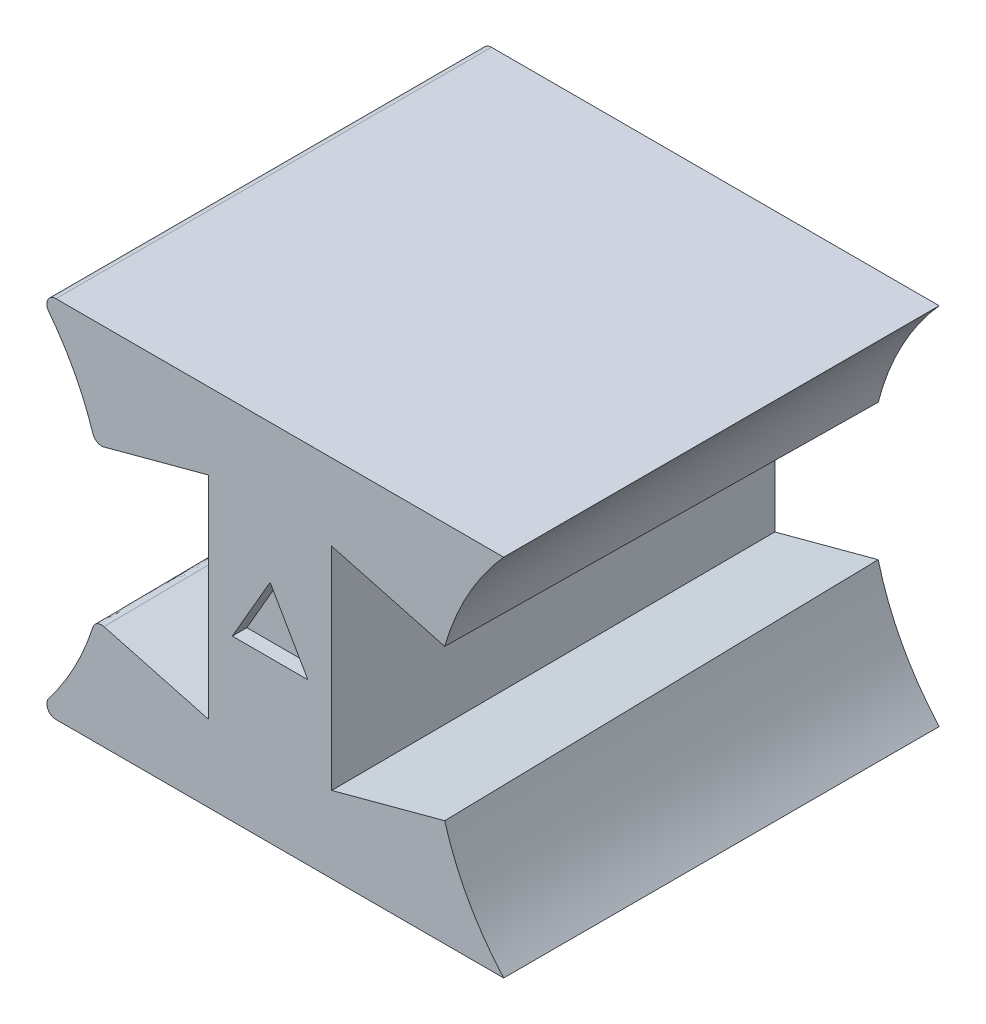
ISO-10303-21;
HEADER;
FILE_DESCRIPTION(('STEP AP214'),'2;1');
FILE_NAME('part.step','',(''),(''),'','','');
FILE_SCHEMA(('AUTOMOTIVE_DESIGN { 1 0 10303 214 1 1 1 1 }'));
ENDSEC;
DATA;
#1=APPLICATION_CONTEXT('core data for automotive mechanical design processes');
#2=APPLICATION_PROTOCOL_DEFINITION('international standard','automotive_design',2000,#1);
#3=PRODUCT_CONTEXT('',#1,'mechanical');
#4=PRODUCT('Part','Part','',(#3));
#5=PRODUCT_RELATED_PRODUCT_CATEGORY('part','',(#4));
#6=PRODUCT_DEFINITION_FORMATION('','',#4);
#7=PRODUCT_DEFINITION_CONTEXT('part definition',#1,'design');
#8=PRODUCT_DEFINITION('design','',#6,#7);
#9=PRODUCT_DEFINITION_SHAPE('','',#8);
#10=(LENGTH_UNIT() NAMED_UNIT(*) SI_UNIT(.MILLI.,.METRE.));
#11=(NAMED_UNIT(*) PLANE_ANGLE_UNIT() SI_UNIT($,.RADIAN.));
#12=(NAMED_UNIT(*) SI_UNIT($,.STERADIAN.) SOLID_ANGLE_UNIT());
#13=UNCERTAINTY_MEASURE_WITH_UNIT(LENGTH_MEASURE(1.E-05),#10,'distance_accuracy_value','');
#14=(GEOMETRIC_REPRESENTATION_CONTEXT(3) GLOBAL_UNCERTAINTY_ASSIGNED_CONTEXT((#13)) GLOBAL_UNIT_ASSIGNED_CONTEXT((#10,
#11,#12)) REPRESENTATION_CONTEXT('',''));
#15=CARTESIAN_POINT('',(0.,0.,0.));
#16=DIRECTION('',(0.,0.,1.));
#17=DIRECTION('',(1.,0.,0.));
#18=AXIS2_PLACEMENT_3D('',#15,#16,#17);
#19=CARTESIAN_POINT('',(0.,0.,-14.));
#20=DIRECTION('',(0.,0.,1.));
#21=DIRECTION('',(0.236420781889134,0.971650767452448,0.));
#22=AXIS2_PLACEMENT_3D('',#19,#20,#21);
#23=CYLINDRICAL_SURFACE('',#22,15.);
#24=CARTESIAN_POINT('',(0.,0.,-34.2436863156225));
#25=DIRECTION('',(-0.25878212734058,0.965788047325803,-0.0168895888551719));
#26=DIRECTION('',(-0.00437134725966975,0.0163140900706145,0.99985736072117));
#27=AXIS2_PLACEMENT_3D('',#24,#25,#26);
#28=ELLIPSE('',#27,888.121086228027,15.);
#29=CARTESIAN_POINT('',(14.2779785755318,4.59775247231231,9.9));
#30=VERTEX_POINT('',#29);
#31=CARTESIAN_POINT('',(14.396617108475,4.21158115580895,-14.));
#32=VERTEX_POINT('',#31);
#33=EDGE_CURVE('E209',#30,#32,#28,.T.);
#34=ORIENTED_EDGE('',*,*,#33,.F.);
#35=CARTESIAN_POINT('',(0.,0.,9.9));
#36=DIRECTION('',(0.,0.,-1.));
#37=DIRECTION('',(0.236420781889134,0.971650767452448,0.));
#38=AXIS2_PLACEMENT_3D('',#35,#36,#37);
#39=CIRCLE('',#38,15.);
#40=CARTESIAN_POINT('',(11.8523697231444,9.19354838709677,9.9));
#41=VERTEX_POINT('',#40);
#42=EDGE_CURVE('E341',#41,#30,#39,.T.);
#43=ORIENTED_EDGE('',*,*,#42,.F.);
#44=DIRECTION('',(0.,0.,1.));
#45=VECTOR('',#44,1.);
#46=CARTESIAN_POINT('',(11.8523697231444,9.19354838709677,-14.));
#47=LINE('',#46,#45);
#48=CARTESIAN_POINT('',(11.8523697231444,9.19354838709677,-14.));
#49=VERTEX_POINT('',#48);
#50=EDGE_CURVE('E343',#49,#41,#47,.T.);
#51=ORIENTED_EDGE('',*,*,#50,.F.);
#52=CARTESIAN_POINT('',(0.,0.,-14.));
#53=DIRECTION('',(0.,0.,-1.));
#54=DIRECTION('',(0.236420781889134,0.971650767452448,0.));
#55=AXIS2_PLACEMENT_3D('',#52,#53,#54);
#56=CIRCLE('',#55,15.);
#57=EDGE_CURVE('E236',#49,#32,#56,.T.);
#58=ORIENTED_EDGE('',*,*,#57,.T.);
#59=EDGE_LOOP('',(#34,#43,#51,#58));
#60=FACE_BOUND('',#59,.T.);
#61=ADVANCED_FACE('F16',(#60),#23,.F.);
#62=CARTESIAN_POINT('',(11.1803398874989,-10.,-14.));
#63=DIRECTION('',(0.,-1.,0.));
#64=DIRECTION('',(0.,0.,-1.));
#65=AXIS2_PLACEMENT_3D('',#62,#63,#64);
#66=PLANE('',#65);
#67=DIRECTION('',(0.,0.,1.));
#68=VECTOR('',#67,1.);
#69=CARTESIAN_POINT('',(12.2474487139159,-10.,-14.));
#70=LINE('',#69,#68);
#71=CARTESIAN_POINT('',(12.2474487139159,-10.,-14.));
#72=VERTEX_POINT('',#71);
#73=CARTESIAN_POINT('',(12.2474487139159,-10.,9.9));
#74=VERTEX_POINT('',#73);
#75=EDGE_CURVE('E244',#72,#74,#70,.T.);
#76=ORIENTED_EDGE('',*,*,#75,.F.);
#77=DIRECTION('',(-1.,0.,0.));
#78=VECTOR('',#77,1.);
#79=CARTESIAN_POINT('',(30.,-10.,-14.));
#80=LINE('',#79,#78);
#81=CARTESIAN_POINT('',(36.819660112501,-10.,-14.));
#82=VERTEX_POINT('',#81);
#83=EDGE_CURVE('E255',#82,#72,#80,.T.);
#84=ORIENTED_EDGE('',*,*,#83,.F.);
#85=DIRECTION('',(0.,0.,1.));
#86=VECTOR('',#85,1.);
#87=CARTESIAN_POINT('',(36.819660112501,-10.,0.));
#88=LINE('',#87,#86);
#89=CARTESIAN_POINT('',(36.819660112501,-10.,9.9));
#90=VERTEX_POINT('',#89);
#91=EDGE_CURVE('E228',#82,#90,#88,.T.);
#92=ORIENTED_EDGE('',*,*,#91,.T.);
#93=DIRECTION('',(1.,0.,0.));
#94=VECTOR('',#93,1.);
#95=CARTESIAN_POINT('',(30.,-10.,9.9));
#96=LINE('',#95,#94);
#97=EDGE_CURVE('E260',#74,#90,#96,.T.);
#98=ORIENTED_EDGE('',*,*,#97,.F.);
#99=EDGE_LOOP('',(#76,#84,#92,#98));
#100=FACE_BOUND('',#99,.T.);
#101=ADVANCED_FACE('F467',(#100),#66,.T.);
#102=CARTESIAN_POINT('',(20.1999695390313,5.,-14.0034904812875));
#103=DIRECTION('',(0.999847695156391,0.,-0.0174524064372835));
#104=DIRECTION('',(0.,-1.,0.));
#105=AXIS2_PLACEMENT_3D('',#102,#103,#104);
#106=PLANE('',#105);
#107=DIRECTION('',(0.,-1.,0.));
#108=VECTOR('',#107,1.);
#109=CARTESIAN_POINT('',(20.6172065173932,2.5,9.9));
#110=LINE('',#109,#108);
#111=CARTESIAN_POINT('',(20.6172065173932,5.80435919374975,9.9));
#112=VERTEX_POINT('',#111);
#113=CARTESIAN_POINT('',(20.6172065173932,-5.80435919374975,9.9));
#114=VERTEX_POINT('',#113);
#115=EDGE_CURVE('E175',#112,#114,#110,.T.);
#116=ORIENTED_EDGE('',*,*,#115,.F.);
#117=DIRECTION('',(0.0174478940480441,0.0227385382260561,0.999589180550005));
#118=VECTOR('',#117,1.);
#119=CARTESIAN_POINT('',(20.1987519787187,5.25901862156866,-14.0732444648759));
#120=LINE('',#119,#118);
#121=CARTESIAN_POINT('',(20.2000304656088,5.2606847781226,-14.));
#122=VERTEX_POINT('',#121);
#123=EDGE_CURVE('E297',#122,#112,#120,.T.);
#124=ORIENTED_EDGE('',*,*,#123,.F.);
#125=DIRECTION('',(0.,-1.,0.));
#126=VECTOR('',#125,1.);
#127=CARTESIAN_POINT('',(20.2000304656088,2.5,-14.));
#128=LINE('',#127,#126);
#129=CARTESIAN_POINT('',(20.2000304656088,-5.26068477812261,-14.));
#130=VERTEX_POINT('',#129);
#131=EDGE_CURVE('E240',#122,#130,#128,.T.);
#132=ORIENTED_EDGE('',*,*,#131,.T.);
#133=DIRECTION('',(0.0174478940480441,-0.0227385382260562,0.999589180550005));
#134=VECTOR('',#133,1.);
#135=CARTESIAN_POINT('',(20.1978824485278,-5.25788542776143,-14.1230598161492));
#136=LINE('',#135,#134);
#137=EDGE_CURVE('E180',#130,#114,#136,.T.);
#138=ORIENTED_EDGE('',*,*,#137,.T.);
#139=EDGE_LOOP('',(#116,#124,#132,#138));
#140=FACE_BOUND('',#139,.T.);
#141=ADVANCED_FACE('F472',(#140),#106,.F.);
#142=CARTESIAN_POINT('',(27.8000304609687,-5.,-14.0034904812875));
#143=DIRECTION('',(-0.999847695156391,0.,-0.0174524064372835));
#144=DIRECTION('',(-0.0174524064372835,0.,0.999847695156391));
#145=AXIS2_PLACEMENT_3D('',#142,#143,#144);
#146=PLANE('',#145);
#147=DIRECTION('',(0.,1.,0.));
#148=VECTOR('',#147,1.);
#149=CARTESIAN_POINT('',(27.3827934826068,-2.5,9.9));
#150=LINE('',#149,#148);
#151=CARTESIAN_POINT('',(27.3827934826068,-5.80435919374975,9.9));
#152=VERTEX_POINT('',#151);
#153=CARTESIAN_POINT('',(27.3827934826068,5.80435919374975,9.9));
#154=VERTEX_POINT('',#153);
#155=EDGE_CURVE('E207',#152,#154,#150,.T.);
#156=ORIENTED_EDGE('',*,*,#155,.F.);
#157=DIRECTION('',(-0.0174478940480441,-0.0227385382260561,0.999589180550005));
#158=VECTOR('',#157,1.);
#159=CARTESIAN_POINT('',(27.8012480212812,-5.25901862156866,-14.0732444648759));
#160=LINE('',#159,#158);
#161=CARTESIAN_POINT('',(27.7999695343912,-5.2606847781226,-14.));
#162=VERTEX_POINT('',#161);
#163=EDGE_CURVE('E11',#162,#152,#160,.T.);
#164=ORIENTED_EDGE('',*,*,#163,.F.);
#165=DIRECTION('',(0.,-1.,0.));
#166=VECTOR('',#165,1.);
#167=CARTESIAN_POINT('',(27.7999695343912,-2.5,-14.));
#168=LINE('',#167,#166);
#169=CARTESIAN_POINT('',(27.7999695343912,5.2606847781226,-14.));
#170=VERTEX_POINT('',#169);
#171=EDGE_CURVE('E222',#170,#162,#168,.T.);
#172=ORIENTED_EDGE('',*,*,#171,.F.);
#173=DIRECTION('',(-0.0174478940480441,0.0227385382260562,0.999589180550005));
#174=VECTOR('',#173,1.);
#175=CARTESIAN_POINT('',(27.8021175514722,5.25788542776143,-14.1230598161492));
#176=LINE('',#175,#174);
#177=EDGE_CURVE('E241',#170,#154,#176,.T.);
#178=ORIENTED_EDGE('',*,*,#177,.T.);
#179=EDGE_LOOP('',(#156,#164,#172,#178));
#180=FACE_BOUND('',#179,.T.);
#181=ADVANCED_FACE('F565',(#180),#146,.F.);
#182=CARTESIAN_POINT('',(33.4769944133549,-3.73946747055844,-14.0034904812875));
#183=DIRECTION('',(0.258779625708333,-0.965778711107158,-0.0174524064372835));
#184=DIRECTION('',(0.,0.0180678631194738,-0.999836762837963));
#185=AXIS2_PLACEMENT_3D('',#182,#183,#184);
#186=PLANE('',#185);
#187=DIRECTION('',(-0.965925826289068,-0.258819045102521,0.));
#188=VECTOR('',#187,1.);
#189=CARTESIAN_POINT('',(28.0406312648972,-5.62809209123437,9.9));
#190=LINE('',#189,#188);
#191=CARTESIAN_POINT('',(33.5834667493533,-4.14289379939574,9.9));
#192=VERTEX_POINT('',#191);
#193=EDGE_CURVE('E289',#192,#152,#190,.T.);
#194=ORIENTED_EDGE('',*,*,#193,.F.);
#195=CARTESIAN_POINT('',(48.,0.,-5.59434206634731));
#196=DIRECTION('',(0.258779625708333,-0.965778711107158,-0.0174524064372835));
#197=DIRECTION('',(-0.00451701516883879,0.0168577301086657,-0.999847695156391));
#198=AXIS2_PLACEMENT_3D('',#195,#196,#197);
#199=ELLIPSE('',#198,859.480327478255,15.);
#200=CARTESIAN_POINT('',(33.4738314749044,-3.7403780531965,-14.));
#201=VERTEX_POINT('',#200);
#202=EDGE_CURVE('E27',#192,#201,#199,.T.);
#203=ORIENTED_EDGE('',*,*,#202,.T.);
#204=DIRECTION('',(0.965925826289068,0.258819045102521,0.));
#205=VECTOR('',#204,1.);
#206=CARTESIAN_POINT('',(27.9326581575347,-5.22513096870651,-14.));
#207=LINE('',#206,#205);
#208=EDGE_CURVE('E217',#162,#201,#207,.T.);
#209=ORIENTED_EDGE('',*,*,#208,.F.);
#210=ORIENTED_EDGE('',*,*,#163,.T.);
#211=EDGE_LOOP('',(#194,#203,#209,#210));
#212=FACE_BOUND('',#211,.T.);
#213=ADVANCED_FACE('F498',(#212),#186,.F.);
#214=CARTESIAN_POINT('',(48.,0.,0.));
#215=DIRECTION('',(0.,0.,1.));
#216=DIRECTION('',(-1.,0.,0.));
#217=AXIS2_PLACEMENT_3D('',#214,#215,#216);
#218=CYLINDRICAL_SURFACE('',#217,15.);
#219=CARTESIAN_POINT('',(48.,0.,9.9));
#220=DIRECTION('',(0.,0.,-1.));
#221=DIRECTION('',(-1.,0.,0.));
#222=AXIS2_PLACEMENT_3D('',#219,#220,#221);
#223=CIRCLE('',#222,15.);
#224=EDGE_CURVE('E293',#90,#192,#223,.T.);
#225=ORIENTED_EDGE('',*,*,#224,.F.);
#226=ORIENTED_EDGE('',*,*,#91,.F.);
#227=CARTESIAN_POINT('',(48.,0.,-14.));
#228=DIRECTION('',(0.,0.,1.));
#229=DIRECTION('',(-1.,0.,0.));
#230=AXIS2_PLACEMENT_3D('',#227,#228,#229);
#231=CIRCLE('',#230,15.);
#232=EDGE_CURVE('E221',#201,#82,#231,.T.);
#233=ORIENTED_EDGE('',*,*,#232,.F.);
#234=ORIENTED_EDGE('',*,*,#202,.F.);
#235=EDGE_LOOP('',(#225,#226,#233,#234));
#236=FACE_BOUND('',#235,.T.);
#237=ADVANCED_FACE('F495',(#236),#218,.F.);
#238=CARTESIAN_POINT('',(48.,0.,0.));
#239=DIRECTION('',(0.,0.,1.));
#240=DIRECTION('',(-1.,0.,0.));
#241=AXIS2_PLACEMENT_3D('',#238,#239,#240);
#242=CYLINDRICAL_SURFACE('',#241,15.);
#243=CARTESIAN_POINT('',(48.,0.,9.9));
#244=DIRECTION('',(0.,0.,-1.));
#245=DIRECTION('',(-1.,0.,0.));
#246=AXIS2_PLACEMENT_3D('',#243,#244,#245);
#247=CIRCLE('',#246,15.);
#248=CARTESIAN_POINT('',(33.5834667493533,4.14289379939574,9.9));
#249=VERTEX_POINT('',#248);
#250=CARTESIAN_POINT('',(36.819660112501,10.,9.9));
#251=VERTEX_POINT('',#250);
#252=EDGE_CURVE('E227',#249,#251,#247,.T.);
#253=ORIENTED_EDGE('',*,*,#252,.F.);
#254=CARTESIAN_POINT('',(48.,0.,-5.59434206634742));
#255=DIRECTION('',(0.258779625708334,0.965778711107158,-0.0174524064372836));
#256=DIRECTION('',(-0.00451701516883882,-0.0168577301086658,-0.999847695156391));
#257=AXIS2_PLACEMENT_3D('',#254,#255,#256);
#258=ELLIPSE('',#257,859.480327478251,15.);
#259=CARTESIAN_POINT('',(33.4738314749044,3.7403780531965,-14.));
#260=VERTEX_POINT('',#259);
#261=EDGE_CURVE('E231',#260,#249,#258,.T.);
#262=ORIENTED_EDGE('',*,*,#261,.F.);
#263=CARTESIAN_POINT('',(48.,0.,-14.));
#264=DIRECTION('',(0.,0.,1.));
#265=DIRECTION('',(-1.,0.,0.));
#266=AXIS2_PLACEMENT_3D('',#263,#264,#265);
#267=CIRCLE('',#266,15.);
#268=CARTESIAN_POINT('',(36.819660112501,10.,-14.));
#269=VERTEX_POINT('',#268);
#270=EDGE_CURVE('E324',#269,#260,#267,.T.);
#271=ORIENTED_EDGE('',*,*,#270,.F.);
#272=DIRECTION('',(0.,0.,-1.));
#273=VECTOR('',#272,1.);
#274=CARTESIAN_POINT('',(36.819660112501,10.,0.));
#275=LINE('',#274,#273);
#276=EDGE_CURVE('E128',#251,#269,#275,.T.);
#277=ORIENTED_EDGE('',*,*,#276,.F.);
#278=EDGE_LOOP('',(#253,#262,#271,#277));
#279=FACE_BOUND('',#278,.T.);
#280=ADVANCED_FACE('F494',(#279),#242,.F.);
#281=CARTESIAN_POINT('',(28.0517559251417,5.19315574222143,-14.0034904812875));
#282=DIRECTION('',(0.258779625708334,0.965778711107158,-0.0174524064372835));
#283=DIRECTION('',(-0.0672883413953232,0.,-0.997733571206395));
#284=AXIS2_PLACEMENT_3D('',#281,#282,#283);
#285=PLANE('',#284);
#286=DIRECTION('',(0.965925826289068,-0.258819045102521,0.));
#287=VECTOR('',#286,1.);
#288=CARTESIAN_POINT('',(25.3280120207905,6.35493622706587,9.9));
#289=LINE('',#288,#287);
#290=EDGE_CURVE('E250',#154,#249,#289,.T.);
#291=ORIENTED_EDGE('',*,*,#290,.F.);
#292=ORIENTED_EDGE('',*,*,#177,.F.);
#293=DIRECTION('',(-0.965925826289068,0.258819045102521,0.));
#294=VECTOR('',#293,1.);
#295=CARTESIAN_POINT('',(25.220038913428,5.95197510453801,-14.));
#296=LINE('',#295,#294);
#297=EDGE_CURVE('E20',#260,#170,#296,.T.);
#298=ORIENTED_EDGE('',*,*,#297,.F.);
#299=ORIENTED_EDGE('',*,*,#261,.T.);
#300=EDGE_LOOP('',(#291,#292,#298,#299));
#301=FACE_BOUND('',#300,.T.);
#302=ADVANCED_FACE('F415',(#301),#285,.F.);
#303=CARTESIAN_POINT('',(0.,0.,-14.));
#304=DIRECTION('',(0.,0.,1.));
#305=DIRECTION('',(0.971650767452448,-0.236420781889134,0.));
#306=AXIS2_PLACEMENT_3D('',#303,#304,#305);
#307=CYLINDRICAL_SURFACE('',#306,15.);
#308=CARTESIAN_POINT('',(0.,0.,-34.2436863156225));
#309=DIRECTION('',(-0.25878212734058,-0.965788047325803,-0.016889588855172));
#310=DIRECTION('',(-0.00437134725966978,-0.0163140900706146,0.99985736072117));
#311=AXIS2_PLACEMENT_3D('',#308,#309,#310);
#312=ELLIPSE('',#311,888.121086228023,15.);
#313=CARTESIAN_POINT('',(14.396617108475,-4.21158115580895,-14.));
#314=VERTEX_POINT('',#313);
#315=CARTESIAN_POINT('',(14.2779785755318,-4.59775247231231,9.9));
#316=VERTEX_POINT('',#315);
#317=EDGE_CURVE('E194',#314,#316,#312,.T.);
#318=ORIENTED_EDGE('',*,*,#317,.F.);
#319=CARTESIAN_POINT('',(0.,0.,-14.));
#320=DIRECTION('',(0.,0.,-1.));
#321=DIRECTION('',(0.971650767452448,-0.236420781889134,0.));
#322=AXIS2_PLACEMENT_3D('',#319,#320,#321);
#323=CIRCLE('',#322,15.);
#324=CARTESIAN_POINT('',(11.8523697231444,-9.19354838709677,-14.));
#325=VERTEX_POINT('',#324);
#326=EDGE_CURVE('E254',#314,#325,#323,.T.);
#327=ORIENTED_EDGE('',*,*,#326,.T.);
#328=DIRECTION('',(0.,0.,-1.));
#329=VECTOR('',#328,1.);
#330=CARTESIAN_POINT('',(11.8523697231444,-9.19354838709677,-14.));
#331=LINE('',#330,#329);
#332=CARTESIAN_POINT('',(11.8523697231444,-9.19354838709677,9.9));
#333=VERTEX_POINT('',#332);
#334=EDGE_CURVE('E41',#333,#325,#331,.T.);
#335=ORIENTED_EDGE('',*,*,#334,.F.);
#336=CARTESIAN_POINT('',(0.,0.,9.9));
#337=DIRECTION('',(0.,0.,-1.));
#338=DIRECTION('',(0.971650767452448,-0.236420781889134,0.));
#339=AXIS2_PLACEMENT_3D('',#336,#337,#338);
#340=CIRCLE('',#339,15.);
#341=EDGE_CURVE('E232',#316,#333,#340,.T.);
#342=ORIENTED_EDGE('',*,*,#341,.F.);
#343=EDGE_LOOP('',(#318,#327,#335,#342));
#344=FACE_BOUND('',#343,.T.);
#345=ADVANCED_FACE('F489',(#344),#307,.F.);
#346=CARTESIAN_POINT('',(12.2474487139159,-9.5,-14.));
#347=DIRECTION('',(0.,0.,1.));
#348=DIRECTION('',(-0.898026510133878,-0.439941345064053,0.));
#349=AXIS2_PLACEMENT_3D('',#346,#347,#348);
#350=CYLINDRICAL_SURFACE('',#349,0.5);
#351=CARTESIAN_POINT('',(12.2474487139159,-9.5,9.9));
#352=DIRECTION('',(0.,0.,-1.));
#353=DIRECTION('',(-0.898026510133878,-0.439941345064053,0.));
#354=AXIS2_PLACEMENT_3D('',#351,#352,#353);
#355=CIRCLE('',#354,0.5);
#356=EDGE_CURVE('E235',#74,#333,#355,.T.);
#357=ORIENTED_EDGE('',*,*,#356,.T.);
#358=ORIENTED_EDGE('',*,*,#334,.T.);
#359=CARTESIAN_POINT('',(12.2474487139159,-9.5,-14.));
#360=DIRECTION('',(0.,0.,1.));
#361=DIRECTION('',(-0.898026510133878,-0.439941345064053,0.));
#362=AXIS2_PLACEMENT_3D('',#359,#360,#361);
#363=CIRCLE('',#362,0.5);
#364=EDGE_CURVE('E251',#325,#72,#363,.T.);
#365=ORIENTED_EDGE('',*,*,#364,.T.);
#366=ORIENTED_EDGE('',*,*,#75,.T.);
#367=EDGE_LOOP('',(#357,#358,#365,#366));
#368=FACE_BOUND('',#367,.T.);
#369=ADVANCED_FACE('F486',(#368),#350,.T.);
#370=CARTESIAN_POINT('',(30.,10.,-14.));
#371=DIRECTION('',(0.,1.,0.));
#372=DIRECTION('',(1.,0.,0.));
#373=AXIS2_PLACEMENT_3D('',#370,#371,#372);
#374=PLANE('',#373);
#375=DIRECTION('',(0.,0.,-1.));
#376=VECTOR('',#375,1.);
#377=CARTESIAN_POINT('',(12.2474487139159,10.,-14.));
#378=LINE('',#377,#376);
#379=CARTESIAN_POINT('',(12.2474487139159,10.,9.9));
#380=VERTEX_POINT('',#379);
#381=CARTESIAN_POINT('',(12.2474487139159,10.,-14.));
#382=VERTEX_POINT('',#381);
#383=EDGE_CURVE('E112',#380,#382,#378,.T.);
#384=ORIENTED_EDGE('',*,*,#383,.F.);
#385=DIRECTION('',(1.,0.,0.));
#386=VECTOR('',#385,1.);
#387=CARTESIAN_POINT('',(30.,10.,9.9));
#388=LINE('',#387,#386);
#389=EDGE_CURVE('E223',#380,#251,#388,.T.);
#390=ORIENTED_EDGE('',*,*,#389,.T.);
#391=ORIENTED_EDGE('',*,*,#276,.T.);
#392=DIRECTION('',(-1.,0.,0.));
#393=VECTOR('',#392,1.);
#394=CARTESIAN_POINT('',(30.,10.,-14.));
#395=LINE('',#394,#393);
#396=EDGE_CURVE('E321',#269,#382,#395,.T.);
#397=ORIENTED_EDGE('',*,*,#396,.T.);
#398=EDGE_LOOP('',(#384,#390,#391,#397));
#399=FACE_BOUND('',#398,.T.);
#400=ADVANCED_FACE('F476',(#399),#374,.T.);
#401=CARTESIAN_POINT('',(12.2474487139159,9.5,-14.));
#402=DIRECTION('',(0.,0.,1.));
#403=DIRECTION('',(-0.898026510133878,0.439941345064053,0.));
#404=AXIS2_PLACEMENT_3D('',#401,#402,#403);
#405=CYLINDRICAL_SURFACE('',#404,0.5);
#406=CARTESIAN_POINT('',(12.2474487139159,9.5,9.9));
#407=DIRECTION('',(0.,0.,-1.));
#408=DIRECTION('',(-0.898026510133878,0.439941345064053,0.));
#409=AXIS2_PLACEMENT_3D('',#406,#407,#408);
#410=CIRCLE('',#409,0.5);
#411=EDGE_CURVE('E226',#41,#380,#410,.T.);
#412=ORIENTED_EDGE('',*,*,#411,.T.);
#413=ORIENTED_EDGE('',*,*,#383,.T.);
#414=CARTESIAN_POINT('',(12.2474487139159,9.5,-14.));
#415=DIRECTION('',(0.,0.,1.));
#416=DIRECTION('',(-0.898026510133878,0.439941345064053,0.));
#417=AXIS2_PLACEMENT_3D('',#414,#415,#416);
#418=CIRCLE('',#417,0.5);
#419=EDGE_CURVE('E239',#382,#49,#418,.T.);
#420=ORIENTED_EDGE('',*,*,#419,.T.);
#421=ORIENTED_EDGE('',*,*,#50,.T.);
#422=EDGE_LOOP('',(#412,#413,#420,#421));
#423=FACE_BOUND('',#422,.T.);
#424=ADVANCED_FACE('F351',(#423),#405,.T.);
#425=CARTESIAN_POINT('',(20.5901699437495,0.,-14.));
#426=DIRECTION('',(0.,0.,-1.));
#427=DIRECTION('',(0.,-1.,0.));
#428=AXIS2_PLACEMENT_3D('',#425,#426,#427);
#429=PLANE('',#428);
#430=CARTESIAN_POINT('',(15.0059369348764,-3.86893161115116,-14.));
#431=CARTESIAN_POINT('',(14.9808296139587,-3.86220412478713,-14.));
#432=CARTESIAN_POINT('',(14.9552855212233,-3.85756376138786,-14.0000017699791));
#433=CARTESIAN_POINT('',(14.9295474830214,-3.85492551811501,-14.0000035830425));
#434=CARTESIAN_POINT('',(14.9031768291049,-3.85222242941219,-14.0000054406692));
#435=CARTESIAN_POINT('',(14.876601239717,-3.85162108010601,-14.0000073499109));
#436=CARTESIAN_POINT('',(14.850073255727,-3.85308314872191,-14.0000083855783));
#437=CARTESIAN_POINT('',(14.8376486477571,-3.8537679210508,-14.0000088706419));
#438=CARTESIAN_POINT('',(14.8252344876881,-3.85490607194999,-14.0000091765836));
#439=CARTESIAN_POINT('',(14.8128574041412,-3.85649754136232,-14.0000092699701));
#440=CARTESIAN_POINT('',(14.7864480360472,-3.85989330914244,-14.0000094692318));
#441=CARTESIAN_POINT('',(14.760411281655,-3.86532331956787,-14.000008661419));
#442=CARTESIAN_POINT('',(14.734996657679,-3.87273042326925,-14.0000071837427));
#443=CARTESIAN_POINT('',(14.7100241281233,-3.88000867835101,-14.000005731771));
#444=CARTESIAN_POINT('',(14.6856509771836,-3.88919617654534,-14.000003645017));
#445=CARTESIAN_POINT('',(14.6621254939157,-3.90028639255604,-14.0000019858542));
#446=CARTESIAN_POINT('',(14.6517365991257,-3.90518385145293,-14.000001253165));
#447=CARTESIAN_POINT('',(14.6415132778344,-3.9104529646475,-14.0000006126223));
#448=CARTESIAN_POINT('',(14.6314786397284,-3.91609597058369,-14.0000001941704));
#449=CARTESIAN_POINT('',(14.630793179429,-3.91648144104088,-14.0000001655862));
#450=CARTESIAN_POINT('',(14.6301086000948,-3.9168686567985,-14.0000001380467));
#451=CARTESIAN_POINT('',(14.6294249061219,-3.91725761314222,-14.0000001115167));
#452=CARTESIAN_POINT('',(14.6068527533807,-3.93009900468296,-13.999999235629));
#453=CARTESIAN_POINT('',(14.5854139236647,-3.94473672699098,-13.999999443561));
#454=CARTESIAN_POINT('',(14.565229626289,-3.96094378226358,-13.9999998087246));
#455=CARTESIAN_POINT('',(14.5445893210297,-3.97751699073126,-14.0000001821381));
#456=CARTESIAN_POINT('',(14.5252598923475,-3.99573216797561,-14.0000007402861));
#457=CARTESIAN_POINT('',(14.5074015823367,-4.01539050072652,-14.0000010781268));
#458=CARTESIAN_POINT('',(14.4990628735574,-4.02456970703423,-14.0000012358771));
#459=CARTESIAN_POINT('',(14.4910454351748,-4.03406409331954,-14.0000013518877));
#460=CARTESIAN_POINT('',(14.4833687453907,-4.04385570065226,-14.0000014076392));
#461=CARTESIAN_POINT('',(14.4669355461707,-4.06481622380848,-14.0000015269841));
#462=CARTESIAN_POINT('',(14.4521865395466,-4.08697670983229,-14.0000013834548));
#463=CARTESIAN_POINT('',(14.4392678222165,-4.11012748226572,-14.0000010839263));
#464=CARTESIAN_POINT('',(14.4266040298254,-4.13282142070403,-14.0000007903085));
#465=CARTESIAN_POINT('',(14.4156983098859,-4.15646807659685,-14.0000003690992));
#466=CARTESIAN_POINT('',(14.4067298757516,-4.18089565438254,-14.0000001478876));
#467=CARTESIAN_POINT('',(14.4030222185913,-4.19099430508695,-14.0000000564362));
#468=CARTESIAN_POINT('',(14.3996462183768,-4.20122663595498,-14.0000000000111));
#469=CARTESIAN_POINT('',(14.396617108475,-4.21158115580894,-14.0000000000002));
#470=(BOUNDED_CURVE() B_SPLINE_CURVE(3,(#430,#431,#432,#433,#434,#435,#436,#437,#438,#439,#440,
#441,#442,#443,#444,#445,#446,#447,#448,#449,#450,#451,#452,#453,#454,#455,#456,#457,#458,#459,
#460,#461,#462,#463,#464,#465,#466,#467,#468,#469),.UNSPECIFIED.,.F.,
.F.) B_SPLINE_CURVE_WITH_KNOTS((4,3,3,3,3,3,3,3,3,3,3,3,3,4),(0.,0.00779790339002286,
0.0157874715909881,0.0195294541247128,0.0275138386334029,0.0353593325630014,0.0388239164817382,
0.0390605801964722,0.0468740314321266,0.054864005798378,0.0585948218360587,0.0665812384980163,
0.0744100592680469,0.0776465867321133),
.UNSPECIFIED.) CURVE() GEOMETRIC_REPRESENTATION_ITEM() RATIONAL_B_SPLINE_CURVE((1.,1.,1.,1.,1.,
1.,1.,1.,1.,1.,1.,1.,1.,1.,1.,1.,1.,1.,1.,1.,1.,1.,1.,1.,1.,1.,1.,1.,1.,1.,1.,1.,1.,1.,1.,1.,1.,
1.,1.,1.)) REPRESENTATION_ITEM(''));
#471=CARTESIAN_POINT('',(15.0059369348764,-3.86893161115115,-14.));
#472=VERTEX_POINT('',#471);
#473=EDGE_CURVE('E201',#472,#314,#470,.T.);
#474=ORIENTED_EDGE('',*,*,#473,.F.);
#475=DIRECTION('',(-0.965925826289068,0.258819045102521,0.));
#476=VECTOR('',#475,1.);
#477=CARTESIAN_POINT('',(19.5985463327964,-5.09951759047538,-14.));
#478=LINE('',#477,#476);
#479=EDGE_CURVE('E186',#130,#472,#478,.T.);
#480=ORIENTED_EDGE('',*,*,#479,.F.);
#481=ORIENTED_EDGE('',*,*,#131,.F.);
#482=DIRECTION('',(0.965925826289068,0.258819045102521,0.));
#483=VECTOR('',#482,1.);
#484=CARTESIAN_POINT('',(16.8859270886897,4.37267345464388,-14.));
#485=LINE('',#484,#483);
#486=CARTESIAN_POINT('',(15.0059369348764,3.86893161115115,-14.));
#487=VERTEX_POINT('',#486);
#488=EDGE_CURVE('E298',#487,#122,#485,.T.);
#489=ORIENTED_EDGE('',*,*,#488,.F.);
#490=CARTESIAN_POINT('',(14.396617108475,4.21158115580895,-14.));
#491=CARTESIAN_POINT('',(14.403916687544,4.18662873122068,-14.0000000000262));
#492=CARTESIAN_POINT('',(14.4132264183635,4.16238744351307,-14.0000003316711));
#493=CARTESIAN_POINT('',(14.4243475388219,4.13902068799152,-14.0000006734444));
#494=CARTESIAN_POINT('',(14.4357411471902,4.11508140397337,-14.0000010235917));
#495=CARTESIAN_POINT('',(14.4490366847335,4.09205888331491,-14.0000013617445));
#496=CARTESIAN_POINT('',(14.4640702650551,4.07014907346664,-14.0000014370631));
#497=CARTESIAN_POINT('',(14.4711218393824,4.05987217007198,-14.0000014723917));
#498=CARTESIAN_POINT('',(14.4785564423214,4.04984047099333,-14.000001453371));
#499=CARTESIAN_POINT('',(14.4863601322515,4.04007681062943,-14.0000013833346));
#500=CARTESIAN_POINT('',(14.502985891698,4.01927533466341,-14.0000012341221));
#501=CARTESIAN_POINT('',(14.5211558851939,3.99984904068954,-14.0000007943422));
#502=CARTESIAN_POINT('',(14.5406918411547,3.98198163109516,-14.0000003343117));
#503=CARTESIAN_POINT('',(14.5598845108621,3.96442818802019,-13.9999998823648));
#504=CARTESIAN_POINT('',(14.5803965198483,3.9483783942172,-13.9999993905647));
#505=CARTESIAN_POINT('',(14.6020935047465,3.93404114955607,-13.9999995268908));
#506=CARTESIAN_POINT('',(14.6116611043628,3.92771893395043,-13.9999995870057));
#507=CARTESIAN_POINT('',(14.6214594949011,3.92173026383075,-13.9999997764951));
#508=CARTESIAN_POINT('',(14.6314786397288,3.91609597058198,-14.0000001942737));
#509=CARTESIAN_POINT('',(14.6321946694949,3.91569330930239,-14.0000002241307));
#510=CARTESIAN_POINT('',(14.632911827045,3.91529245883789,-14.0000002551667));
#511=CARTESIAN_POINT('',(14.6336301051874,3.91489342068608,-14.0000002873329));
#512=CARTESIAN_POINT('',(14.6563344070902,3.90228008591536,-14.0000013040832));
#513=CARTESIAN_POINT('',(14.6799846360917,3.89156891075792,-14.0000033564858));
#514=CARTESIAN_POINT('',(14.7043238857918,3.88274577948719,-14.0000051398187));
#515=CARTESIAN_POINT('',(14.7292079731256,3.87372514114363,-14.0000069630717));
#516=CARTESIAN_POINT('',(14.7548135760368,3.86667766481329,-14.0000084927205));
#517=CARTESIAN_POINT('',(14.7808876641947,3.86163726703046,-14.0000090500474));
#518=CARTESIAN_POINT('',(14.7930587331617,3.85928447031273,-14.0000093102009));
#519=CARTESIAN_POINT('',(14.805332059546,3.8573697180415,-14.0000093696863));
#520=CARTESIAN_POINT('',(14.8176822055512,3.85590034545644,-14.0000092231216));
#521=CARTESIAN_POINT('',(14.8441270834548,3.85275403620709,-14.0000089092885));
#522=CARTESIAN_POINT('',(14.8707217301482,3.85167046942257,-14.0000075832915));
#523=CARTESIAN_POINT('',(14.897211134272,3.85266568472278,-14.0000058311513));
#524=CARTESIAN_POINT('',(14.923175466527,3.85364117290663,-14.0000041137418));
#525=CARTESIAN_POINT('',(14.9490400119326,3.85661384167684,-14.0000019802998));
#526=CARTESIAN_POINT('',(14.9745649305963,3.86164768281363,-14.0000008003837));
#527=CARTESIAN_POINT('',(14.9850859317762,3.86372255910363,-14.0000003140394));
#528=CARTESIAN_POINT('',(14.9955491241758,3.86614820566278,-14.));
#529=CARTESIAN_POINT('',(15.0059369348764,3.86893161115115,-14.));
#530=(BOUNDED_CURVE() B_SPLINE_CURVE(3,(#490,#491,#492,#493,#494,#495,#496,#497,#498,#499,#500,
#501,#502,#503,#504,#505,#506,#507,#508,#509,#510,#511,#512,#513,#514,#515,#516,#517,#518,#519,
#520,#521,#522,#523,#524,#525,#526,#527,#528,#529),.UNSPECIFIED.,.F.,
.F.) B_SPLINE_CURVE_WITH_KNOTS((4,3,3,3,3,3,3,3,3,3,3,3,3,4),(0.,0.0077994653145245,
0.0157900318774307,0.019538046178068,0.027523189709207,0.0353680181203336,0.0388273087843766,
0.0390745309902046,0.0468890630864305,0.0548785246167137,0.0586079086206831,0.0665934907019759,
0.0744207829067953,0.077647079202089),
.UNSPECIFIED.) CURVE() GEOMETRIC_REPRESENTATION_ITEM() RATIONAL_B_SPLINE_CURVE((1.,1.,1.,1.,1.,
1.,1.,1.,1.,1.,1.,1.,1.,1.,1.,1.,1.,1.,1.,1.,1.,1.,1.,1.,1.,1.,1.,1.,1.,1.,1.,1.,1.,1.,1.,1.,1.,
1.,1.,1.)) REPRESENTATION_ITEM(''));
#531=EDGE_CURVE('E216',#32,#487,#530,.T.);
#532=ORIENTED_EDGE('',*,*,#531,.F.);
#533=ORIENTED_EDGE('',*,*,#57,.F.);
#534=ORIENTED_EDGE('',*,*,#419,.F.);
#535=ORIENTED_EDGE('',*,*,#396,.F.);
#536=ORIENTED_EDGE('',*,*,#270,.T.);
#537=ORIENTED_EDGE('',*,*,#297,.T.);
#538=ORIENTED_EDGE('',*,*,#171,.T.);
#539=ORIENTED_EDGE('',*,*,#208,.T.);
#540=ORIENTED_EDGE('',*,*,#232,.T.);
#541=ORIENTED_EDGE('',*,*,#83,.T.);
#542=ORIENTED_EDGE('',*,*,#364,.F.);
#543=ORIENTED_EDGE('',*,*,#326,.F.);
#544=EDGE_LOOP('',(#474,#480,#481,#489,#532,#533,#534,#535,#536,#537,#538,#539,#540,#541,#542,#543));
#545=FACE_BOUND('',#544,.T.);
#546=ADVANCED_FACE('F18',(#545),#429,.T.);
#547=CARTESIAN_POINT('',(14.523005586645,3.73946747055844,-14.0034904812875));
#548=DIRECTION('',(-0.258779625708334,0.965778711107158,-0.0174524064372835));
#549=DIRECTION('',(-0.0672883413953232,0.,0.997733571206395));
#550=AXIS2_PLACEMENT_3D('',#547,#548,#549);
#551=PLANE('',#550);
#552=CARTESIAN_POINT('',(0.129389812854167,-0.482889355553578,-34.2349601124038));
#553=DIRECTION('',(0.258779625708334,-0.965778711107158,0.0174524064372835));
#554=DIRECTION('',(-0.00451701516883879,0.0168577301086657,0.999847695156391));
#555=AXIS2_PLACEMENT_3D('',#552,#553,#554);
#556=ELLIPSE('',#555,888.12967172753,15.5);
#557=CARTESIAN_POINT('',(14.883347752194,4.26797636810051,9.9));
#558=VERTEX_POINT('',#557);
#559=EDGE_CURVE('E302',#487,#558,#556,.T.);
#560=ORIENTED_EDGE('',*,*,#559,.F.);
#561=ORIENTED_EDGE('',*,*,#488,.T.);
#562=ORIENTED_EDGE('',*,*,#123,.T.);
#563=DIRECTION('',(0.965925826289068,0.258819045102521,0.));
#564=VECTOR('',#563,1.);
#565=CARTESIAN_POINT('',(16.7779539813272,4.77563457717174,9.9));
#566=LINE('',#565,#564);
#567=EDGE_CURVE('E269',#558,#112,#566,.T.);
#568=ORIENTED_EDGE('',*,*,#567,.F.);
#569=EDGE_LOOP('',(#560,#561,#562,#568));
#570=FACE_BOUND('',#569,.T.);
#571=ADVANCED_FACE('F482',(#570),#551,.F.);
#572=CARTESIAN_POINT('',(15.0059369348764,3.86893161115115,-14.));
#573=CARTESIAN_POINT('',(14.9668533234536,4.00253756403355,-6.0270119879245));
#574=CARTESIAN_POINT('',(14.9259697351755,4.13561697027148,1.943527639576));
#575=CARTESIAN_POINT('',(14.8833010075704,4.26812153250248,9.90872620321864));
#576=CARTESIAN_POINT('',(14.8813318945259,3.83554286403564,-14.0000513081926));
#577=CARTESIAN_POINT('',(14.842971802434,3.96936647172025,-6.02708366490278));
#578=CARTESIAN_POINT('',(14.8028100592925,4.10259190821967,1.94343722445592));
#579=CARTESIAN_POINT('',(14.7608646781741,4.23531282747671,9.9086161118902));
#580=CARTESIAN_POINT('',(14.6058799710694,3.87051005632722,-14.0019875309694));
#581=CARTESIAN_POINT('',(14.569257194863,4.00343868479446,-6.02903657574886));
#582=CARTESIAN_POINT('',(14.5308616871051,4.13588862116525,1.9414661180853));
#583=CARTESIAN_POINT('',(14.4906497892939,4.26774257814217,9.90662911617664));
#584=CARTESIAN_POINT('',(14.4328716141808,4.08764640403198,-14.0064742428495));
#585=CARTESIAN_POINT('',(14.395975364674,4.21799099872104,-6.03349895245523));
#586=CARTESIAN_POINT('',(14.357240337698,4.34781947410626,1.93702856677514));
#587=CARTESIAN_POINT('',(14.3168254842,4.4771162847336,9.90221493453648));
#588=CARTESIAN_POINT('',(14.3966585051828,4.21143964519813,-14.0087262032186));
#589=CARTESIAN_POINT('',(14.3588356554188,4.34073572863271,-6.03573819114314));
#590=CARTESIAN_POINT('',(14.319270892569,4.46952225079844,1.93480143635736));
#591=CARTESIAN_POINT('',(14.2779785755318,4.59775247231231,9.9));
#592=(BOUNDED_SURFACE() B_SPLINE_SURFACE(3,3,((#572,#573,#574,#575),(#576,#577,#578,#579),(#580,
#581,#582,#583),(#584,#585,#586,#587),(#588,#589,#590,#591)),.UNSPECIFIED.,.F.,.F.,
.F.) B_SPLINE_SURFACE_WITH_KNOTS((4,1,4),(4,4),(0.,0.5,1.),(-1.54800709343953,
-1.52106415732945),
.UNSPECIFIED.) GEOMETRIC_REPRESENTATION_ITEM() RATIONAL_B_SPLINE_SURFACE(((1.,1.,1.,1.),(1.,1.,
1.,1.),(1.,1.,1.,1.),(1.,1.,1.,1.),(1.,1.,1.,1.))) REPRESENTATION_ITEM('') SURFACE());
#593=CARTESIAN_POINT('',(14.883347752194,4.2679763681005,9.89999999999982));
#594=CARTESIAN_POINT('',(14.8582278137125,4.26124549573243,9.90000000009239));
#595=CARTESIAN_POINT('',(14.8326705433778,4.25659991452731,9.89999830207263));
#596=CARTESIAN_POINT('',(14.8069193371295,4.2539568289497,9.89999658890309));
#597=CARTESIAN_POINT('',(14.7805547049773,4.25125078177163,9.89999483492371));
#598=CARTESIAN_POINT('',(14.7539854465721,4.25064375656681,9.89999305811199));
#599=CARTESIAN_POINT('',(14.727464143762,4.25209990789021,9.89999213657056));
#600=CARTESIAN_POINT('',(14.7150463050582,4.2527817089462,9.89999170508525));
#601=CARTESIAN_POINT('',(14.7026389851184,4.25391656939167,9.89999144870814));
#602=CARTESIAN_POINT('',(14.6902687937762,4.25550468423549,9.89999139678042));
#603=CARTESIAN_POINT('',(14.663868090837,4.25889406982099,9.89999128595534));
#604=CARTESIAN_POINT('',(14.637840179656,4.26431841537029,9.89999214332447));
#605=CARTESIAN_POINT('',(14.6124345660279,4.27172302605605,9.89999360044349));
#606=CARTESIAN_POINT('',(14.5874441797879,4.27900661635633,9.89999503374747));
#607=CARTESIAN_POINT('',(14.5630546141846,4.28820658851342,9.89999703508909));
#608=CARTESIAN_POINT('',(14.5395149502256,4.29931878363224,9.89999851923602));
#609=CARTESIAN_POINT('',(14.5311580596388,4.30326375918281,9.89999904612772));
#610=CARTESIAN_POINT('',(14.5229084858972,4.30745016388268,9.89999950186444));
#611=CARTESIAN_POINT('',(14.5147782053178,4.31187919119769,9.89999981939417));
#612=CARTESIAN_POINT('',(14.5121226770207,4.313325808845,9.89999992310636));
#613=CARTESIAN_POINT('',(14.5094798796447,4.31479831571424,9.90000001200269));
#614=CARTESIAN_POINT('',(14.5068500684275,4.31629644732987,9.90000008796951));
#615=CARTESIAN_POINT('',(14.4842424220947,4.3291754059049,9.90000074103202));
#616=CARTESIAN_POINT('',(14.4627633729611,4.34384681278246,9.90000045413738));
#617=CARTESIAN_POINT('',(14.4425396233804,4.36008680101985,9.9000000781824));
#618=CARTESIAN_POINT('',(14.4219014308819,4.37665959342321,9.89999969452301));
#619=CARTESIAN_POINT('',(14.4025695220442,4.394866839709,9.89999919742316));
#620=CARTESIAN_POINT('',(14.3847090381343,4.41451431939046,9.89999892767931));
#621=CARTESIAN_POINT('',(14.3763885358751,4.42366731322321,9.89999880201618));
#622=CARTESIAN_POINT('',(14.3683878915683,4.43313339994473,9.89999871976081));
#623=CARTESIAN_POINT('',(14.3607269476723,4.44289520552713,9.89999869458838));
#624=CARTESIAN_POINT('',(14.344292715747,4.4638361991084,9.89999864058855));
#625=CARTESIAN_POINT('',(14.3295400539895,4.48598181903179,9.89999883682954));
#626=CARTESIAN_POINT('',(14.3166226303621,4.50912877024544,9.89999914001717));
#627=CARTESIAN_POINT('',(14.3039695730284,4.5318019989988,9.89999943699979));
#628=CARTESIAN_POINT('',(14.293076694184,4.55543709866423,9.89999981439354));
#629=CARTESIAN_POINT('',(14.2841307170226,4.57986795437769,9.8999999490513));
#630=CARTESIAN_POINT('',(14.2819645977212,4.58578347899328,9.89999998165643));
#631=CARTESIAN_POINT('',(14.2799128482436,4.5917457321704,9.9));
#632=CARTESIAN_POINT('',(14.2779785755318,4.59775247231231,9.9));
#633=(BOUNDED_CURVE() B_SPLINE_CURVE(3,(#593,#594,#595,#596,#597,#598,#599,#600,#601,#602,#603,
#604,#605,#606,#607,#608,#609,#610,#611,#612,#613,#614,#615,#616,#617,#618,#619,#620,#621,#622,
#623,#624,#625,#626,#627,#628,#629,#630,#631,#632),.UNSPECIFIED.,.F.,
.F.) B_SPLINE_CURVE_WITH_KNOTS((4,3,3,3,3,3,3,3,3,3,3,3,3,4),(0.,0.00780182215826191,
0.0157894934671689,0.0195294912584966,0.0275114672806067,0.0353629865027518,0.0381503791857463,
0.0390608028879287,0.0468874244102596,0.0548744359655158,0.0585952728714485,0.0665772000985794,
0.0743957702525038,0.0762889067331375),
.UNSPECIFIED.) CURVE() GEOMETRIC_REPRESENTATION_ITEM() RATIONAL_B_SPLINE_CURVE((1.,1.,1.,1.,1.,
1.,1.,1.,1.,1.,1.,1.,1.,1.,1.,1.,1.,1.,1.,1.,1.,1.,1.,1.,1.,1.,1.,1.,1.,1.,1.,1.,1.,1.,1.,1.,1.,
1.,1.,1.)) REPRESENTATION_ITEM(''));
#634=EDGE_CURVE('E331',#558,#30,#633,.T.);
#635=ORIENTED_EDGE('',*,*,#634,.T.);
#636=ORIENTED_EDGE('',*,*,#33,.T.);
#637=ORIENTED_EDGE('',*,*,#531,.T.);
#638=ORIENTED_EDGE('',*,*,#559,.T.);
#639=EDGE_LOOP('',(#635,#636,#637,#638));
#640=FACE_BOUND('',#639,.T.);
#641=ADVANCED_FACE('F481',(#640),#592,.F.);
#642=CARTESIAN_POINT('',(20.5901699437495,0.,9.9));
#643=DIRECTION('',(0.,0.,-1.));
#644=DIRECTION('',(0.,-1.,0.));
#645=AXIS2_PLACEMENT_3D('',#642,#643,#644);
#646=PLANE('',#645);
#647=DIRECTION('',(0.5,0.866025403784439,0.));
#648=VECTOR('',#647,1.);
#649=CARTESIAN_POINT('',(22.0193659390022,-1.03739530305011,9.9));
#650=LINE('',#649,#648);
#651=CARTESIAN_POINT('',(21.9274595947114,-1.19658176089975,9.9));
#652=VERTEX_POINT('',#651);
#653=CARTESIAN_POINT('',(24.,2.3931635217995,9.9));
#654=VERTEX_POINT('',#653);
#655=EDGE_CURVE('E272',#652,#654,#650,.T.);
#656=ORIENTED_EDGE('',*,*,#655,.T.);
#657=DIRECTION('',(0.5,-0.866025403784439,0.));
#658=VECTOR('',#657,1.);
#659=CARTESIAN_POINT('',(24.0919063442908,2.23397706394986,9.9));
#660=LINE('',#659,#658);
#661=CARTESIAN_POINT('',(26.0725404052886,-1.19658176089975,9.9));
#662=VERTEX_POINT('',#661);
#663=EDGE_CURVE('E265',#654,#662,#660,.T.);
#664=ORIENTED_EDGE('',*,*,#663,.T.);
#665=DIRECTION('',(-1.,0.,0.));
#666=VECTOR('',#665,1.);
#667=CARTESIAN_POINT('',(23.331355174519,-1.19658176089975,9.9));
#668=LINE('',#667,#666);
#669=EDGE_CURVE('E335',#662,#652,#668,.T.);
#670=ORIENTED_EDGE('',*,*,#669,.T.);
#671=EDGE_LOOP('',(#656,#664,#670));
#672=FACE_BOUND('',#671,.T.);
#673=CARTESIAN_POINT('',(14.2779785755318,-4.59775247231231,9.9));
#674=CARTESIAN_POINT('',(14.2859515028627,-4.57299313907275,9.9));
#675=CARTESIAN_POINT('',(14.2959134814207,-4.54899736050333,9.89999968750259));
#676=CARTESIAN_POINT('',(14.3076629708904,-4.52592480112177,9.89999937078792));
#677=CARTESIAN_POINT('',(14.3196913764119,-4.50230453222637,9.8999990465549));
#678=CARTESIAN_POINT('',(14.3335938823351,-4.47965070103531,9.89999874059575));
#679=CARTESIAN_POINT('',(14.3492034489359,-4.45815615214616,9.89999868895789));
#680=CARTESIAN_POINT('',(14.3565229779194,-4.44807707835724,9.89999866474422));
#681=CARTESIAN_POINT('',(14.3642184800631,-4.43825331759828,9.89999869297014));
#682=CARTESIAN_POINT('',(14.3722756302479,-4.4287074435619,9.89999876873816));
#683=CARTESIAN_POINT('',(14.3894454805865,-4.40836511100051,9.89999893020032));
#684=CARTESIAN_POINT('',(14.4081224835977,-4.38943960119745,9.89999936647862));
#685=CARTESIAN_POINT('',(14.4281255552127,-4.37211107374761,9.89999979269863));
#686=CARTESIAN_POINT('',(14.4477981642125,-4.35506882385607,9.90000021187724));
#687=CARTESIAN_POINT('',(14.4687543626145,-4.33957030693268,9.90000064183187));
#688=CARTESIAN_POINT('',(14.4908557697751,-4.32582268118956,9.90000039785445));
#689=CARTESIAN_POINT('',(14.4986876806653,-4.32095103754305,9.90000031139799));
#690=CARTESIAN_POINT('',(14.5066636444201,-4.31629965508842,9.90000013502904));
#691=CARTESIAN_POINT('',(14.5147782053244,-4.31187919117634,9.89999981809999));
#692=CARTESIAN_POINT('',(14.5174641883294,-4.31041598311345,9.899999713194));
#693=CARTESIAN_POINT('',(14.5201653593426,-4.30897808294178,9.8999995927837));
#694=CARTESIAN_POINT('',(14.5228813453363,-4.30756556454475,9.89999945929434));
#695=CARTESIAN_POINT('',(14.5459676474294,-4.29555893914147,9.899998324614));
#696=CARTESIAN_POINT('',(14.5699475912565,-4.2854731721097,9.89999633853085));
#697=CARTESIAN_POINT('',(14.5945644014262,-4.27729354596592,9.8999947119341));
#698=CARTESIAN_POINT('',(14.619680551587,-4.26894800009426,9.89999305234262));
#699=CARTESIAN_POINT('',(14.6454609832309,-4.26258637875205,9.89999177952532));
#700=CARTESIAN_POINT('',(14.6716530536097,-4.25824237167421,9.89999146668573));
#701=CARTESIAN_POINT('',(14.6838510736448,-4.25621930573854,9.89999132099188));
#702=CARTESIAN_POINT('',(14.696138530822,-4.25463456041283,9.89999137235851));
#703=CARTESIAN_POINT('',(14.7084900930924,-4.25349540502731,9.89999161537053));
#704=CARTESIAN_POINT('',(14.7349940339902,-4.25105100922131,9.8999921368249));
#705=CARTESIAN_POINT('',(14.7615974916084,-4.25067295734909,9.89999360534233));
#706=CARTESIAN_POINT('',(14.7880463734957,-4.25238023549338,9.89999533508831));
#707=CARTESIAN_POINT('',(14.8139517381727,-4.25405242954383,9.89999702928848));
#708=CARTESIAN_POINT('',(14.8397101284989,-4.25772513371418,9.89999898103901));
#709=CARTESIAN_POINT('',(14.8650807670451,-4.26346524383704,9.89999971899299));
#710=CARTESIAN_POINT('',(14.8711935026875,-4.26484825103554,9.8999998967937));
#711=CARTESIAN_POINT('',(14.8772836694705,-4.26635150079157,9.9000000000222));
#712=CARTESIAN_POINT('',(14.8833477521939,-4.2679763681005,9.89999999999986));
#713=(BOUNDED_CURVE() B_SPLINE_CURVE(3,(#673,#674,#675,#676,#677,#678,#679,#680,#681,#682,#683,
#684,#685,#686,#687,#688,#689,#690,#691,#692,#693,#694,#695,#696,#697,#698,#699,#700,#701,#702,
#703,#704,#705,#706,#707,#708,#709,#710,#711,#712),.UNSPECIFIED.,.F.,
.F.) B_SPLINE_CURVE_WITH_KNOTS((4,3,3,3,3,3,3,3,3,3,3,3,3,4),(0.,0.00780341551772416,
0.0157920729433336,0.0195380584060806,0.0275207828546706,0.035371627957469,0.0381536734087704,
0.0390745521709645,0.0469021644432911,0.0548885560137685,0.0586079322591686,0.0665889573332606,
0.0744059745486406,0.076289386338347),
.UNSPECIFIED.) CURVE() GEOMETRIC_REPRESENTATION_ITEM() RATIONAL_B_SPLINE_CURVE((1.,1.,1.,1.,1.,
1.,1.,1.,1.,1.,1.,1.,1.,1.,1.,1.,1.,1.,1.,1.,1.,1.,1.,1.,1.,1.,1.,1.,1.,1.,1.,1.,1.,1.,1.,1.,1.,
1.,1.,1.)) REPRESENTATION_ITEM(''));
#714=CARTESIAN_POINT('',(14.883347752194,-4.26797636810052,9.9));
#715=VERTEX_POINT('',#714);
#716=EDGE_CURVE('E171',#316,#715,#713,.T.);
#717=ORIENTED_EDGE('',*,*,#716,.F.);
#718=ORIENTED_EDGE('',*,*,#341,.T.);
#719=ORIENTED_EDGE('',*,*,#356,.F.);
#720=ORIENTED_EDGE('',*,*,#97,.T.);
#721=ORIENTED_EDGE('',*,*,#224,.T.);
#722=ORIENTED_EDGE('',*,*,#193,.T.);
#723=ORIENTED_EDGE('',*,*,#155,.T.);
#724=ORIENTED_EDGE('',*,*,#290,.T.);
#725=ORIENTED_EDGE('',*,*,#252,.T.);
#726=ORIENTED_EDGE('',*,*,#389,.F.);
#727=ORIENTED_EDGE('',*,*,#411,.F.);
#728=ORIENTED_EDGE('',*,*,#42,.T.);
#729=ORIENTED_EDGE('',*,*,#634,.F.);
#730=ORIENTED_EDGE('',*,*,#567,.T.);
#731=ORIENTED_EDGE('',*,*,#115,.T.);
#732=DIRECTION('',(-0.965925826289068,0.258819045102521,0.));
#733=VECTOR('',#732,1.);
#734=CARTESIAN_POINT('',(19.4905732254339,-5.50247871300324,9.9));
#735=LINE('',#734,#733);
#736=EDGE_CURVE('E166',#114,#715,#735,.T.);
#737=ORIENTED_EDGE('',*,*,#736,.T.);
#738=EDGE_LOOP('',(#717,#718,#719,#720,#721,#722,#723,#724,#725,#726,#727,#728,#729,#730,#731,#737));
#739=FACE_BOUND('',#738,.T.);
#740=ADVANCED_FACE('F168',(#672,#739),#646,.F.);
#741=CARTESIAN_POINT('',(19.9482440748583,-5.19315574222143,-14.0034904812875));
#742=DIRECTION('',(-0.258779625708334,-0.965778711107158,-0.0174524064372835));
#743=DIRECTION('',(-0.965925826289068,0.258819045102522,0.));
#744=AXIS2_PLACEMENT_3D('',#741,#742,#743);
#745=PLANE('',#744);
#746=CARTESIAN_POINT('',(0.129389812854166,0.482889355553577,-34.2349601124038));
#747=DIRECTION('',(0.258779625708334,0.965778711107158,0.0174524064372836));
#748=DIRECTION('',(-0.00451701516883882,-0.0168577301086658,0.999847695156391));
#749=AXIS2_PLACEMENT_3D('',#746,#747,#748);
#750=ELLIPSE('',#749,888.129671727526,15.5);
#751=EDGE_CURVE('E181',#715,#472,#750,.T.);
#752=ORIENTED_EDGE('',*,*,#751,.F.);
#753=ORIENTED_EDGE('',*,*,#736,.F.);
#754=ORIENTED_EDGE('',*,*,#137,.F.);
#755=ORIENTED_EDGE('',*,*,#479,.T.);
#756=EDGE_LOOP('',(#752,#753,#754,#755));
#757=FACE_BOUND('',#756,.T.);
#758=ADVANCED_FACE('F184',(#757),#745,.F.);
#759=CARTESIAN_POINT('',(14.8833010075704,-4.26812153250248,9.90872620321868));
#760=CARTESIAN_POINT('',(14.9259697351755,-4.13561697027148,1.94352763957602));
#761=CARTESIAN_POINT('',(14.9668533234536,-4.00253756403355,-6.02701198792451));
#762=CARTESIAN_POINT('',(15.0059369348764,-3.86893161115116,-14.));
#763=CARTESIAN_POINT('',(14.7608646781741,-4.23531282747671,9.90861611189024));
#764=CARTESIAN_POINT('',(14.8028100592925,-4.10259190821968,1.94343722445595));
#765=CARTESIAN_POINT('',(14.842971802434,-3.96936647172026,-6.02708366490278));
#766=CARTESIAN_POINT('',(14.881331894526,-3.83554286403564,-14.0000513081926));
#767=CARTESIAN_POINT('',(14.4906497892939,-4.26774257814217,9.90662911617668));
#768=CARTESIAN_POINT('',(14.5308616871051,-4.13588862116525,1.9414661180853));
#769=CARTESIAN_POINT('',(14.569257194863,-4.00343868479446,-6.02903657574888));
#770=CARTESIAN_POINT('',(14.6058799710694,-3.87051005632722,-14.0019875309694));
#771=CARTESIAN_POINT('',(14.3168254842,-4.4771162847336,9.90221493453653));
#772=CARTESIAN_POINT('',(14.357240337698,-4.34781947410627,1.93702856677517));
#773=CARTESIAN_POINT('',(14.395975364674,-4.21799099872105,-6.03349895245524));
#774=CARTESIAN_POINT('',(14.4328716141808,-4.08764640403198,-14.0064742428495));
#775=CARTESIAN_POINT('',(14.2779785755318,-4.59775247231231,9.9));
#776=CARTESIAN_POINT('',(14.319270892569,-4.46952225079845,1.93480143635737));
#777=CARTESIAN_POINT('',(14.3588356554188,-4.34073572863271,-6.03573819114315));
#778=CARTESIAN_POINT('',(14.3966585051828,-4.21143964519813,-14.0087262032187));
#779=(BOUNDED_SURFACE() B_SPLINE_SURFACE(3,3,((#759,#760,#761,#762),(#763,#764,#765,#766),(#767,
#768,#769,#770),(#771,#772,#773,#774),(#775,#776,#777,#778)),.UNSPECIFIED.,.F.,.F.,
.F.) B_SPLINE_SURFACE_WITH_KNOTS((4,1,4),(4,4),(0.,0.5,1.),(1.52106415732945,1.54800709343953),
.UNSPECIFIED.) GEOMETRIC_REPRESENTATION_ITEM() RATIONAL_B_SPLINE_SURFACE(((1.,1.,1.,1.),(1.,1.,
1.,1.),(1.,1.,1.,1.),(1.,1.,1.,1.),(1.,1.,1.,1.))) REPRESENTATION_ITEM('') SURFACE());
#780=ORIENTED_EDGE('',*,*,#473,.T.);
#781=ORIENTED_EDGE('',*,*,#317,.T.);
#782=ORIENTED_EDGE('',*,*,#716,.T.);
#783=ORIENTED_EDGE('',*,*,#751,.T.);
#784=EDGE_LOOP('',(#780,#781,#782,#783));
#785=FACE_BOUND('',#784,.T.);
#786=ADVANCED_FACE('F192',(#785),#779,.F.);
#787=CARTESIAN_POINT('',(24.,0.598290880449875,9.1));
#788=DIRECTION('',(0.,0.,-1.));
#789=DIRECTION('',(0.,-1.,0.));
#790=AXIS2_PLACEMENT_3D('',#787,#788,#789);
#791=PLANE('',#790);
#792=DIRECTION('',(0.5,-0.866025403784439,0.));
#793=VECTOR('',#792,1.);
#794=CARTESIAN_POINT('',(26.0725404052886,-1.19658176089975,9.1));
#795=LINE('',#794,#793);
#796=CARTESIAN_POINT('',(24.,2.3931635217995,9.1));
#797=VERTEX_POINT('',#796);
#798=CARTESIAN_POINT('',(26.0725404052886,-1.19658176089975,9.1));
#799=VERTEX_POINT('',#798);
#800=EDGE_CURVE('E280',#797,#799,#795,.T.);
#801=ORIENTED_EDGE('',*,*,#800,.F.);
#802=DIRECTION('',(0.5,0.866025403784439,0.));
#803=VECTOR('',#802,1.);
#804=CARTESIAN_POINT('',(24.,2.3931635217995,9.1));
#805=LINE('',#804,#803);
#806=CARTESIAN_POINT('',(21.9274595947114,-1.19658176089975,9.1));
#807=VERTEX_POINT('',#806);
#808=EDGE_CURVE('E281',#807,#797,#805,.T.);
#809=ORIENTED_EDGE('',*,*,#808,.F.);
#810=DIRECTION('',(-1.,0.,0.));
#811=VECTOR('',#810,1.);
#812=CARTESIAN_POINT('',(21.9274595947114,-1.19658176089975,9.1));
#813=LINE('',#812,#811);
#814=EDGE_CURVE('E261',#799,#807,#813,.T.);
#815=ORIENTED_EDGE('',*,*,#814,.F.);
#816=EDGE_LOOP('',(#801,#809,#815));
#817=FACE_BOUND('',#816,.T.);
#818=ADVANCED_FACE('F448',(#817),#791,.F.);
#819=CARTESIAN_POINT('',(24.,2.3931635217995,9.9));
#820=DIRECTION('',(0.866025403784439,0.5,0.));
#821=DIRECTION('',(0.,0.,-1.));
#822=AXIS2_PLACEMENT_3D('',#819,#820,#821);
#823=PLANE('',#822);
#824=ORIENTED_EDGE('',*,*,#663,.F.);
#825=DIRECTION('',(0.,0.,-1.));
#826=VECTOR('',#825,1.);
#827=CARTESIAN_POINT('',(24.,2.3931635217995,9.9));
#828=LINE('',#827,#826);
#829=EDGE_CURVE('E285',#654,#797,#828,.T.);
#830=ORIENTED_EDGE('',*,*,#829,.T.);
#831=ORIENTED_EDGE('',*,*,#800,.T.);
#832=DIRECTION('',(0.,0.,-1.));
#833=VECTOR('',#832,1.);
#834=CARTESIAN_POINT('',(26.0725404052886,-1.19658176089975,9.9));
#835=LINE('',#834,#833);
#836=EDGE_CURVE('E266',#662,#799,#835,.T.);
#837=ORIENTED_EDGE('',*,*,#836,.F.);
#838=EDGE_LOOP('',(#824,#830,#831,#837));
#839=FACE_BOUND('',#838,.T.);
#840=ADVANCED_FACE('F454',(#839),#823,.F.);
#841=CARTESIAN_POINT('',(26.0725404052886,-1.19658176089975,9.9));
#842=DIRECTION('',(0.,-1.,0.));
#843=DIRECTION('',(0.,0.,-1.));
#844=AXIS2_PLACEMENT_3D('',#841,#842,#843);
#845=PLANE('',#844);
#846=ORIENTED_EDGE('',*,*,#669,.F.);
#847=ORIENTED_EDGE('',*,*,#836,.T.);
#848=ORIENTED_EDGE('',*,*,#814,.T.);
#849=DIRECTION('',(0.,0.,-1.));
#850=VECTOR('',#849,1.);
#851=CARTESIAN_POINT('',(21.9274595947114,-1.19658176089975,9.9));
#852=LINE('',#851,#850);
#853=EDGE_CURVE('E276',#652,#807,#852,.T.);
#854=ORIENTED_EDGE('',*,*,#853,.F.);
#855=EDGE_LOOP('',(#846,#847,#848,#854));
#856=FACE_BOUND('',#855,.T.);
#857=ADVANCED_FACE('F444',(#856),#845,.F.);
#858=CARTESIAN_POINT('',(21.9274595947114,-1.19658176089975,9.9));
#859=DIRECTION('',(-0.866025403784439,0.5,0.));
#860=DIRECTION('',(0.,0.,1.));
#861=AXIS2_PLACEMENT_3D('',#858,#859,#860);
#862=PLANE('',#861);
#863=ORIENTED_EDGE('',*,*,#655,.F.);
#864=ORIENTED_EDGE('',*,*,#853,.T.);
#865=ORIENTED_EDGE('',*,*,#808,.T.);
#866=ORIENTED_EDGE('',*,*,#829,.F.);
#867=EDGE_LOOP('',(#863,#864,#865,#866));
#868=FACE_BOUND('',#867,.T.);
#869=ADVANCED_FACE('F451',(#868),#862,.F.);
#870=CLOSED_SHELL('',(#61,#101,#141,#181,#213,#237,#280,#302,#345,#369,#400,#424,#546,#571,#641,
#740,#758,#786,#818,#840,#857,#869));
#871=MANIFOLD_SOLID_BREP('B1',#870);
#872=ADVANCED_BREP_SHAPE_REPRESENTATION('',(#18,#871),#14);
#873=SHAPE_DEFINITION_REPRESENTATION(#9,#872);
ENDSEC;
END-ISO-10303-21;
